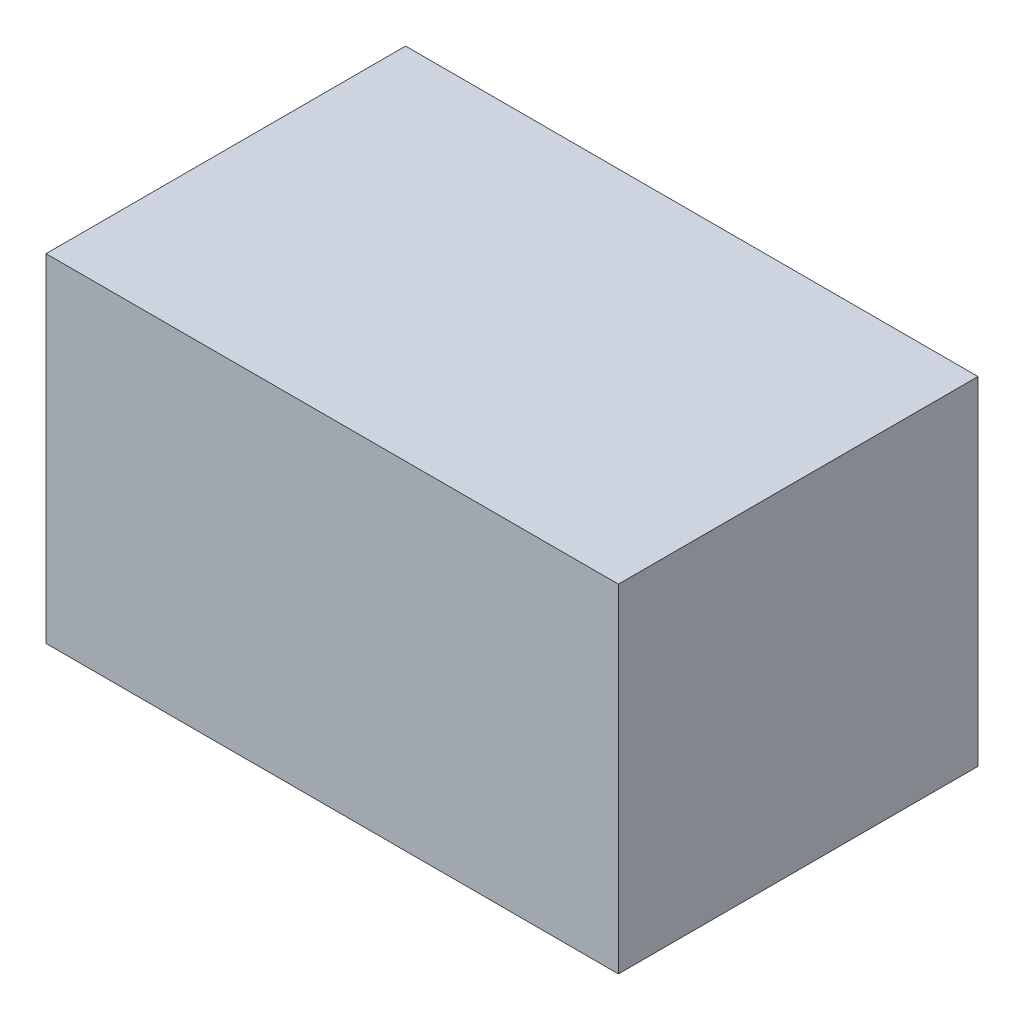
ISO-10303-21;
HEADER;
FILE_DESCRIPTION(('STEP AP214'),'2;1');
FILE_NAME('part.step','',(''),(''),'','','');
FILE_SCHEMA(('AUTOMOTIVE_DESIGN { 1 0 10303 214 1 1 1 1 }'));
ENDSEC;
DATA;
#1=APPLICATION_CONTEXT('core data for automotive mechanical design processes');
#2=APPLICATION_PROTOCOL_DEFINITION('international standard','automotive_design',2000,#1);
#3=PRODUCT_CONTEXT('',#1,'mechanical');
#4=PRODUCT('Part','Part','',(#3));
#5=PRODUCT_RELATED_PRODUCT_CATEGORY('part','',(#4));
#6=PRODUCT_DEFINITION_FORMATION('','',#4);
#7=PRODUCT_DEFINITION_CONTEXT('part definition',#1,'design');
#8=PRODUCT_DEFINITION('design','',#6,#7);
#9=PRODUCT_DEFINITION_SHAPE('','',#8);
#10=(LENGTH_UNIT() NAMED_UNIT(*) SI_UNIT(.MILLI.,.METRE.));
#11=(NAMED_UNIT(*) PLANE_ANGLE_UNIT() SI_UNIT($,.RADIAN.));
#12=(NAMED_UNIT(*) SI_UNIT($,.STERADIAN.) SOLID_ANGLE_UNIT());
#13=UNCERTAINTY_MEASURE_WITH_UNIT(LENGTH_MEASURE(1.E-05),#10,'distance_accuracy_value','');
#14=(GEOMETRIC_REPRESENTATION_CONTEXT(3) GLOBAL_UNCERTAINTY_ASSIGNED_CONTEXT((#13)) GLOBAL_UNIT_ASSIGNED_CONTEXT((#10,
#11,#12)) REPRESENTATION_CONTEXT('',''));
#15=CARTESIAN_POINT('',(0.,0.,0.));
#16=DIRECTION('',(0.,0.,1.));
#17=DIRECTION('',(1.,0.,0.));
#18=AXIS2_PLACEMENT_3D('',#15,#16,#17);
#19=CARTESIAN_POINT('',(39.,23.,49.));
#20=DIRECTION('',(-1.,0.,0.));
#21=DIRECTION('',(0.,-1.,0.));
#22=AXIS2_PLACEMENT_3D('',#19,#20,#21);
#23=PLANE('',#22);
#24=DIRECTION('',(0.,1.,0.));
#25=VECTOR('',#24,1.);
#26=CARTESIAN_POINT('',(39.,23.,0.));
#27=LINE('',#26,#25);
#28=CARTESIAN_POINT('',(39.,-23.,0.));
#29=VERTEX_POINT('',#28);
#30=CARTESIAN_POINT('',(39.,23.,0.));
#31=VERTEX_POINT('',#30);
#32=EDGE_CURVE('E110',#29,#31,#27,.T.);
#33=ORIENTED_EDGE('',*,*,#32,.T.);
#34=DIRECTION('',(0.,0.,-1.));
#35=VECTOR('',#34,1.);
#36=CARTESIAN_POINT('',(39.,23.,49.));
#37=LINE('',#36,#35);
#38=CARTESIAN_POINT('',(39.,23.,49.));
#39=VERTEX_POINT('',#38);
#40=EDGE_CURVE('E11',#39,#31,#37,.T.);
#41=ORIENTED_EDGE('',*,*,#40,.F.);
#42=DIRECTION('',(0.,1.,0.));
#43=VECTOR('',#42,1.);
#44=CARTESIAN_POINT('',(39.,23.,49.));
#45=LINE('',#44,#43);
#46=CARTESIAN_POINT('',(39.,-23.,49.));
#47=VERTEX_POINT('',#46);
#48=EDGE_CURVE('E94',#47,#39,#45,.T.);
#49=ORIENTED_EDGE('',*,*,#48,.F.);
#50=DIRECTION('',(0.,0.,-1.));
#51=VECTOR('',#50,1.);
#52=CARTESIAN_POINT('',(39.,-23.,49.));
#53=LINE('',#52,#51);
#54=EDGE_CURVE('E106',#47,#29,#53,.T.);
#55=ORIENTED_EDGE('',*,*,#54,.T.);
#56=EDGE_LOOP('',(#33,#41,#49,#55));
#57=FACE_BOUND('',#56,.T.);
#58=ADVANCED_FACE('F42',(#57),#23,.F.);
#59=CARTESIAN_POINT('',(-39.,23.,49.));
#60=DIRECTION('',(0.,-1.,0.));
#61=DIRECTION('',(0.,0.,-1.));
#62=AXIS2_PLACEMENT_3D('',#59,#60,#61);
#63=PLANE('',#62);
#64=DIRECTION('',(-1.,0.,0.));
#65=VECTOR('',#64,1.);
#66=CARTESIAN_POINT('',(-39.,23.,0.));
#67=LINE('',#66,#65);
#68=CARTESIAN_POINT('',(-39.,23.,0.));
#69=VERTEX_POINT('',#68);
#70=EDGE_CURVE('E99',#31,#69,#67,.T.);
#71=ORIENTED_EDGE('',*,*,#70,.T.);
#72=DIRECTION('',(0.,0.,-1.));
#73=VECTOR('',#72,1.);
#74=CARTESIAN_POINT('',(-39.,23.,49.));
#75=LINE('',#74,#73);
#76=CARTESIAN_POINT('',(-39.,23.,49.));
#77=VERTEX_POINT('',#76);
#78=EDGE_CURVE('E51',#77,#69,#75,.T.);
#79=ORIENTED_EDGE('',*,*,#78,.F.);
#80=DIRECTION('',(-1.,0.,0.));
#81=VECTOR('',#80,1.);
#82=CARTESIAN_POINT('',(-39.,23.,49.));
#83=LINE('',#82,#81);
#84=EDGE_CURVE('E89',#39,#77,#83,.T.);
#85=ORIENTED_EDGE('',*,*,#84,.F.);
#86=ORIENTED_EDGE('',*,*,#40,.T.);
#87=EDGE_LOOP('',(#71,#79,#85,#86));
#88=FACE_BOUND('',#87,.T.);
#89=ADVANCED_FACE('F98',(#88),#63,.F.);
#90=CARTESIAN_POINT('',(-39.,23.,49.));
#91=DIRECTION('',(1.,0.,0.));
#92=DIRECTION('',(0.,1.,0.));
#93=AXIS2_PLACEMENT_3D('',#90,#91,#92);
#94=PLANE('',#93);
#95=DIRECTION('',(0.,-1.,0.));
#96=VECTOR('',#95,1.);
#97=CARTESIAN_POINT('',(-39.,23.,0.));
#98=LINE('',#97,#96);
#99=CARTESIAN_POINT('',(-39.,-23.,0.));
#100=VERTEX_POINT('',#99);
#101=EDGE_CURVE('E76',#69,#100,#98,.T.);
#102=ORIENTED_EDGE('',*,*,#101,.T.);
#103=DIRECTION('',(0.,0.,-1.));
#104=VECTOR('',#103,1.);
#105=CARTESIAN_POINT('',(-39.,-23.,49.));
#106=LINE('',#105,#104);
#107=CARTESIAN_POINT('',(-39.,-23.,49.));
#108=VERTEX_POINT('',#107);
#109=EDGE_CURVE('E101',#108,#100,#106,.T.);
#110=ORIENTED_EDGE('',*,*,#109,.F.);
#111=DIRECTION('',(0.,-1.,0.));
#112=VECTOR('',#111,1.);
#113=CARTESIAN_POINT('',(-39.,23.,49.));
#114=LINE('',#113,#112);
#115=EDGE_CURVE('E92',#77,#108,#114,.T.);
#116=ORIENTED_EDGE('',*,*,#115,.F.);
#117=ORIENTED_EDGE('',*,*,#78,.T.);
#118=EDGE_LOOP('',(#102,#110,#116,#117));
#119=FACE_BOUND('',#118,.T.);
#120=ADVANCED_FACE('F102',(#119),#94,.F.);
#121=CARTESIAN_POINT('',(-39.,-23.,49.));
#122=DIRECTION('',(0.,1.,0.));
#123=DIRECTION('',(0.,0.,1.));
#124=AXIS2_PLACEMENT_3D('',#121,#122,#123);
#125=PLANE('',#124);
#126=DIRECTION('',(1.,0.,0.));
#127=VECTOR('',#126,1.);
#128=CARTESIAN_POINT('',(-39.,-23.,0.));
#129=LINE('',#128,#127);
#130=EDGE_CURVE('E82',#100,#29,#129,.T.);
#131=ORIENTED_EDGE('',*,*,#130,.T.);
#132=ORIENTED_EDGE('',*,*,#54,.F.);
#133=DIRECTION('',(1.,0.,0.));
#134=VECTOR('',#133,1.);
#135=CARTESIAN_POINT('',(-39.,-23.,49.));
#136=LINE('',#135,#134);
#137=EDGE_CURVE('E59',#108,#47,#136,.T.);
#138=ORIENTED_EDGE('',*,*,#137,.F.);
#139=ORIENTED_EDGE('',*,*,#109,.T.);
#140=EDGE_LOOP('',(#131,#132,#138,#139));
#141=FACE_BOUND('',#140,.T.);
#142=ADVANCED_FACE('F123',(#141),#125,.F.);
#143=CARTESIAN_POINT('',(39.,-23.,49.));
#144=DIRECTION('',(0.,0.,1.));
#145=DIRECTION('',(1.,0.,0.));
#146=AXIS2_PLACEMENT_3D('',#143,#144,#145);
#147=PLANE('',#146);
#148=ORIENTED_EDGE('',*,*,#48,.T.);
#149=ORIENTED_EDGE('',*,*,#84,.T.);
#150=ORIENTED_EDGE('',*,*,#115,.T.);
#151=ORIENTED_EDGE('',*,*,#137,.T.);
#152=EDGE_LOOP('',(#148,#149,#150,#151));
#153=FACE_BOUND('',#152,.T.);
#154=ADVANCED_FACE('F90',(#153),#147,.T.);
#155=CARTESIAN_POINT('',(39.,-23.,0.));
#156=DIRECTION('',(0.,0.,1.));
#157=DIRECTION('',(1.,0.,0.));
#158=AXIS2_PLACEMENT_3D('',#155,#156,#157);
#159=PLANE('',#158);
#160=ORIENTED_EDGE('',*,*,#32,.F.);
#161=ORIENTED_EDGE('',*,*,#130,.F.);
#162=ORIENTED_EDGE('',*,*,#101,.F.);
#163=ORIENTED_EDGE('',*,*,#70,.F.);
#164=EDGE_LOOP('',(#160,#161,#162,#163));
#165=FACE_BOUND('',#164,.T.);
#166=ADVANCED_FACE('F126',(#165),#159,.F.);
#167=CLOSED_SHELL('',(#58,#89,#120,#142,#154,#166));
#168=MANIFOLD_SOLID_BREP('B2',#167);
#169=ADVANCED_BREP_SHAPE_REPRESENTATION('',(#18,#168),#14);
#170=SHAPE_DEFINITION_REPRESENTATION(#9,#169);
ENDSEC;
END-ISO-10303-21;
